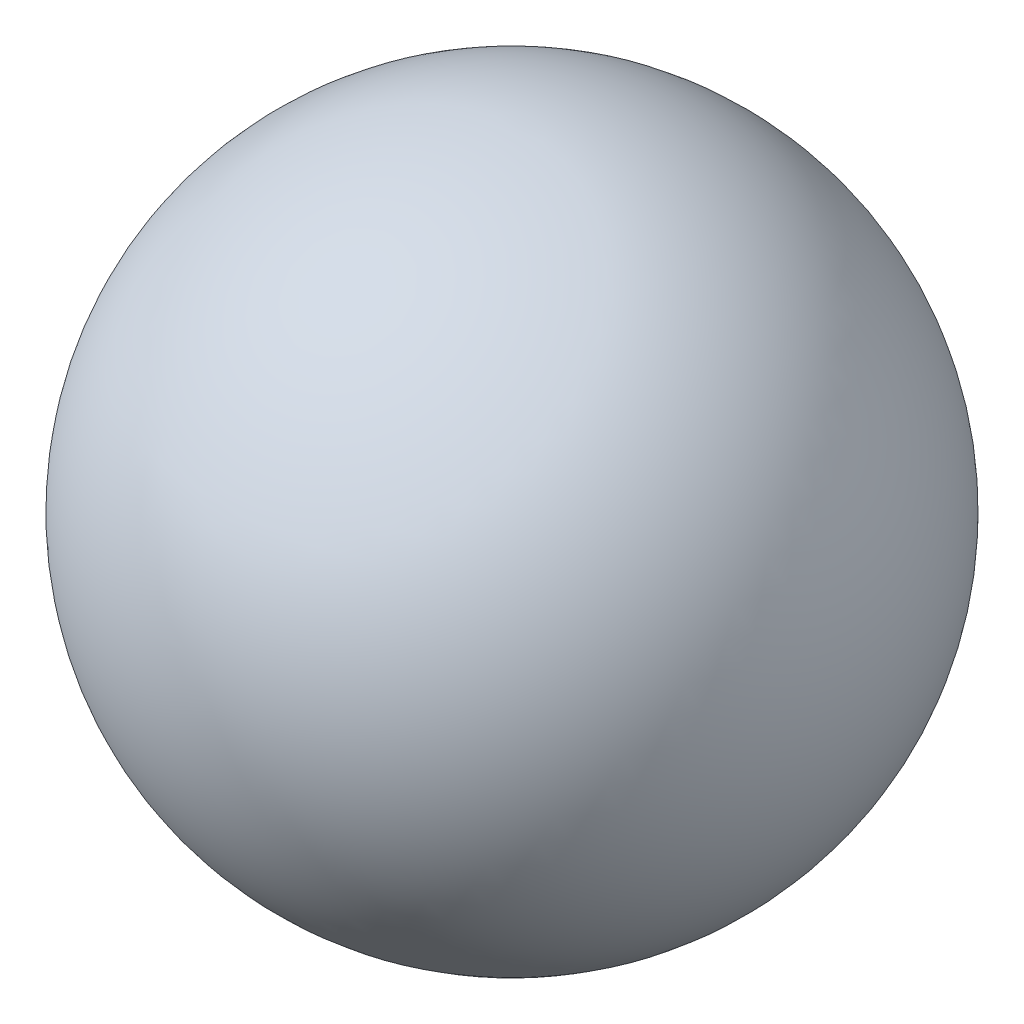
ISO-10303-21;
HEADER;
FILE_DESCRIPTION(('STEP AP214'),'2;1');
FILE_NAME('part.step','',(''),(''),'','','');
FILE_SCHEMA(('AUTOMOTIVE_DESIGN { 1 0 10303 214 1 1 1 1 }'));
ENDSEC;
DATA;
#1=APPLICATION_CONTEXT('core data for automotive mechanical design processes');
#2=APPLICATION_PROTOCOL_DEFINITION('international standard','automotive_design',2000,#1);
#3=PRODUCT_CONTEXT('',#1,'mechanical');
#4=PRODUCT('Part','Part','',(#3));
#5=PRODUCT_RELATED_PRODUCT_CATEGORY('part','',(#4));
#6=PRODUCT_DEFINITION_FORMATION('','',#4);
#7=PRODUCT_DEFINITION_CONTEXT('part definition',#1,'design');
#8=PRODUCT_DEFINITION('design','',#6,#7);
#9=PRODUCT_DEFINITION_SHAPE('','',#8);
#10=(LENGTH_UNIT() NAMED_UNIT(*) SI_UNIT(.MILLI.,.METRE.));
#11=(NAMED_UNIT(*) PLANE_ANGLE_UNIT() SI_UNIT($,.RADIAN.));
#12=(NAMED_UNIT(*) SI_UNIT($,.STERADIAN.) SOLID_ANGLE_UNIT());
#13=UNCERTAINTY_MEASURE_WITH_UNIT(LENGTH_MEASURE(1.E-05),#10,'distance_accuracy_value','');
#14=(GEOMETRIC_REPRESENTATION_CONTEXT(3) GLOBAL_UNCERTAINTY_ASSIGNED_CONTEXT((#13)) GLOBAL_UNIT_ASSIGNED_CONTEXT((#10,
#11,#12)) REPRESENTATION_CONTEXT('',''));
#15=CARTESIAN_POINT('',(0.,0.,0.));
#16=DIRECTION('',(0.,0.,1.));
#17=DIRECTION('',(1.,0.,0.));
#18=AXIS2_PLACEMENT_3D('',#15,#16,#17);
#19=CARTESIAN_POINT('',(0.,0.,0.));
#20=DIRECTION('',(0.,0.,-1.));
#21=DIRECTION('',(1.,0.,0.));
#22=AXIS2_PLACEMENT_3D('',#19,#20,#21);
#23=SPHERICAL_SURFACE('',#22,20.);
#24=CARTESIAN_POINT('',(0.,0.,0.));
#25=DIRECTION('',(0.,1.,0.));
#26=DIRECTION('',(0.,0.,1.));
#27=AXIS2_PLACEMENT_3D('',#24,#25,#26);
#28=SPHERICAL_SURFACE('',#27,20.);
#29=CARTESIAN_POINT('',(0.,-18.,0.));
#30=DIRECTION('',(0.,1.,0.));
#31=DIRECTION('',(0.,0.,1.));
#32=AXIS2_PLACEMENT_3D('',#29,#30,#31);
#33=CIRCLE('',#32,8.71779788708134);
#34=CARTESIAN_POINT('',(0.,-18.,8.71779788708134));
#35=VERTEX_POINT('',#34);
#36=EDGE_CURVE('E11',#35,#35,#33,.T.);
#37=ORIENTED_EDGE('',*,*,#36,.T.);
#38=EDGE_LOOP('',(#37));
#39=FACE_BOUND('',#38,.T.);
#40=ADVANCED_FACE('F39',(#39),#28,.T.);
#41=CARTESIAN_POINT('',(111.602540378444,-18.,8.71779788708134));
#42=DIRECTION('',(0.,1.,0.));
#43=DIRECTION('',(0.,0.,1.));
#44=AXIS2_PLACEMENT_3D('',#41,#42,#43);
#45=PLANE('',#44);
#46=CARTESIAN_POINT('',(0.,-18.,0.));
#47=DIRECTION('',(0.,-1.,0.));
#48=DIRECTION('',(0.,0.,-1.));
#49=AXIS2_PLACEMENT_3D('',#46,#47,#48);
#50=CIRCLE('',#49,4.25);
#51=CARTESIAN_POINT('',(0.,-18.,-4.25));
#52=VERTEX_POINT('',#51);
#53=EDGE_CURVE('E57',#52,#52,#50,.T.);
#54=ORIENTED_EDGE('',*,*,#53,.F.);
#55=EDGE_LOOP('',(#54));
#56=FACE_BOUND('',#55,.T.);
#57=ORIENTED_EDGE('',*,*,#36,.F.);
#58=EDGE_LOOP('',(#57));
#59=FACE_BOUND('',#58,.T.);
#60=ADVANCED_FACE('F52',(#56,#59),#45,.F.);
#61=CARTESIAN_POINT('',(0.,-8.,0.));
#62=DIRECTION('',(0.,-1.,0.));
#63=DIRECTION('',(0.,0.,-1.));
#64=AXIS2_PLACEMENT_3D('',#61,#62,#63);
#65=CONICAL_SURFACE('',#64,4.25,1.02974425867665);
#66=CARTESIAN_POINT('',(0.,-5.44634236913287,0.));
#67=VERTEX_POINT('',#66);
#68=VERTEX_LOOP('',#67);
#69=FACE_BOUND('',#68,.T.);
#70=CARTESIAN_POINT('',(0.,-8.,0.));
#71=DIRECTION('',(0.,-1.,0.));
#72=DIRECTION('',(0.,0.,-1.));
#73=AXIS2_PLACEMENT_3D('',#70,#71,#72);
#74=CIRCLE('',#73,4.25);
#75=CARTESIAN_POINT('',(0.,-8.,-4.25));
#76=VERTEX_POINT('',#75);
#77=EDGE_CURVE('E45',#76,#76,#74,.T.);
#78=ORIENTED_EDGE('',*,*,#77,.T.);
#79=EDGE_LOOP('',(#78));
#80=FACE_BOUND('',#79,.T.);
#81=ADVANCED_FACE('F48',(#69,#80),#65,.F.);
#82=CARTESIAN_POINT('',(0.,-18.,0.));
#83=DIRECTION('',(0.,-1.,0.));
#84=DIRECTION('',(0.,0.,-1.));
#85=AXIS2_PLACEMENT_3D('',#82,#83,#84);
#86=CYLINDRICAL_SURFACE('',#85,4.25);
#87=ORIENTED_EDGE('',*,*,#77,.F.);
#88=EDGE_LOOP('',(#87));
#89=FACE_BOUND('',#88,.T.);
#90=ORIENTED_EDGE('',*,*,#53,.T.);
#91=EDGE_LOOP('',(#90));
#92=FACE_BOUND('',#91,.T.);
#93=ADVANCED_FACE('F51',(#89,#92),#86,.F.);
#94=CLOSED_SHELL('',(#40,#60,#81,#93));
#95=MANIFOLD_SOLID_BREP('B2',#94);
#96=ADVANCED_BREP_SHAPE_REPRESENTATION('',(#18,#95),#14);
#97=SHAPE_DEFINITION_REPRESENTATION(#9,#96);
ENDSEC;
END-ISO-10303-21;
